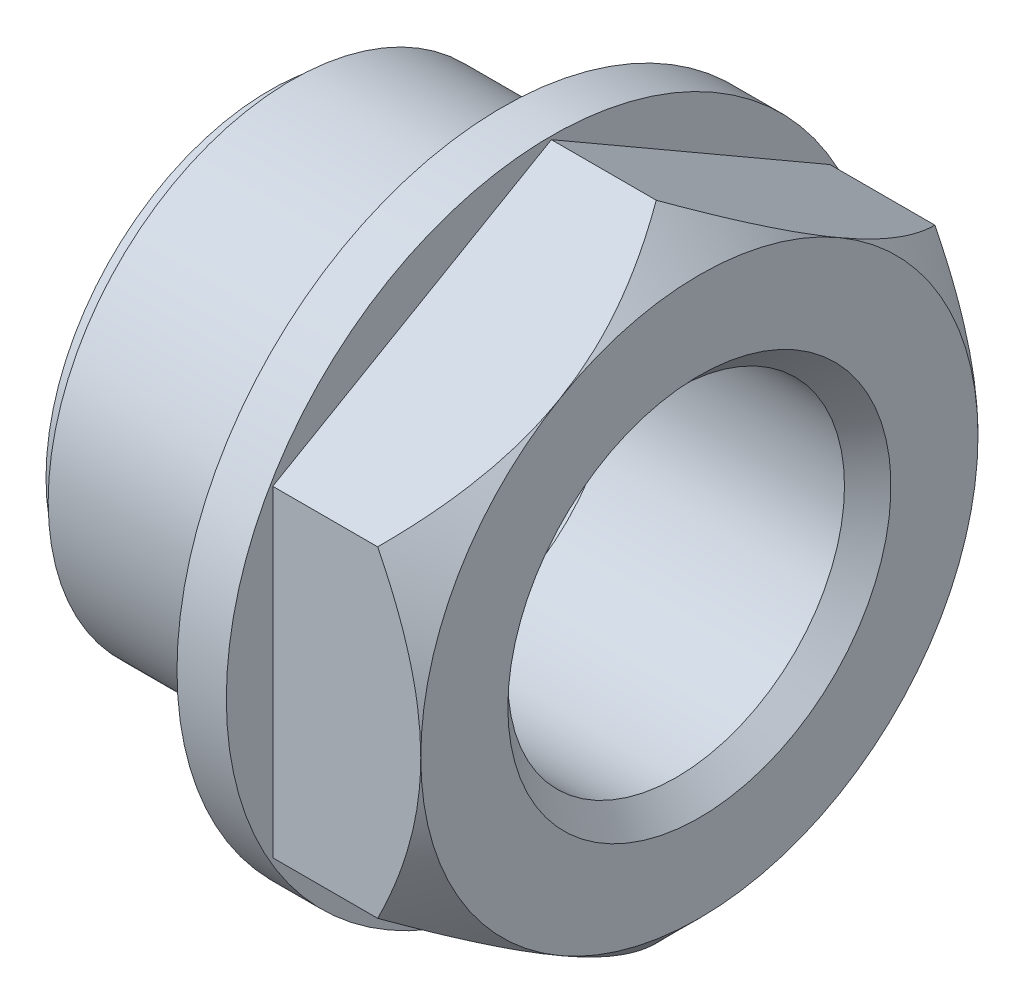
ISO-10303-21;
HEADER;
FILE_DESCRIPTION(('STEP AP214'),'2;1');
FILE_NAME('part.step','',(''),(''),'','','');
FILE_SCHEMA(('AUTOMOTIVE_DESIGN { 1 0 10303 214 1 1 1 1 }'));
ENDSEC;
DATA;
#1=APPLICATION_CONTEXT('core data for automotive mechanical design processes');
#2=APPLICATION_PROTOCOL_DEFINITION('international standard','automotive_design',2000,#1);
#3=PRODUCT_CONTEXT('',#1,'mechanical');
#4=PRODUCT('Part','Part','',(#3));
#5=PRODUCT_RELATED_PRODUCT_CATEGORY('part','',(#4));
#6=PRODUCT_DEFINITION_FORMATION('','',#4);
#7=PRODUCT_DEFINITION_CONTEXT('part definition',#1,'design');
#8=PRODUCT_DEFINITION('design','',#6,#7);
#9=PRODUCT_DEFINITION_SHAPE('','',#8);
#10=(LENGTH_UNIT() NAMED_UNIT(*) SI_UNIT(.MILLI.,.METRE.));
#11=(NAMED_UNIT(*) PLANE_ANGLE_UNIT() SI_UNIT($,.RADIAN.));
#12=(NAMED_UNIT(*) SI_UNIT($,.STERADIAN.) SOLID_ANGLE_UNIT());
#13=UNCERTAINTY_MEASURE_WITH_UNIT(LENGTH_MEASURE(1.E-05),#10,'distance_accuracy_value','');
#14=(GEOMETRIC_REPRESENTATION_CONTEXT(3) GLOBAL_UNCERTAINTY_ASSIGNED_CONTEXT((#13)) GLOBAL_UNIT_ASSIGNED_CONTEXT((#10,
#11,#12)) REPRESENTATION_CONTEXT('',''));
#15=CARTESIAN_POINT('',(0.,0.,0.));
#16=DIRECTION('',(0.,0.,1.));
#17=DIRECTION('',(1.,0.,0.));
#18=AXIS2_PLACEMENT_3D('',#15,#16,#17);
#19=CARTESIAN_POINT('',(18.5,0.,0.));
#20=DIRECTION('',(-1.,0.,0.));
#21=DIRECTION('',(0.,0.,1.));
#22=AXIS2_PLACEMENT_3D('',#19,#20,#21);
#23=CONICAL_SURFACE('',#22,12.,0.785398163397449);
#24=CARTESIAN_POINT('',(16.6434780679518,-6.92808776022166,-12.0002));
#25=CARTESIAN_POINT('',(16.7626309564783,-7.04725827421276,-11.7937906150033));
#26=CARTESIAN_POINT('',(16.8781461645336,-7.16736256447531,-11.5857638820616));
#27=CARTESIAN_POINT('',(17.1007451125441,-7.40958418453946,-11.1662237294189));
#28=CARTESIAN_POINT('',(17.2078242362867,-7.53170257285939,-10.9547084763103));
#29=CARTESIAN_POINT('',(17.4128476016986,-7.77867303027696,-10.5269430960946));
#30=CARTESIAN_POINT('',(17.5107360726841,-7.9035367425358,-10.3106728024406));
#31=CARTESIAN_POINT('',(17.6952506861876,-8.15531589028206,-9.87457852625775));
#32=CARTESIAN_POINT('',(17.7818785585455,-8.2822310072591,-9.65475509540497));
#33=CARTESIAN_POINT('',(17.9410500559202,-8.53594594203989,-9.21530793772564));
#34=CARTESIAN_POINT('',(18.0138038761164,-8.66271260305016,-8.99574164015001));
#35=CARTESIAN_POINT('',(18.1455183810797,-8.91802167176284,-8.55353336150658));
#36=CARTESIAN_POINT('',(18.2044805504032,-9.04656388676268,-8.33089171420943));
#37=CARTESIAN_POINT('',(18.3071286295363,-9.30487475223742,-7.88348417106011));
#38=CARTESIAN_POINT('',(18.3508488796767,-9.43463996031193,-7.65872423762031));
#39=CARTESIAN_POINT('',(18.4220532673444,-9.69525900315613,-7.20731881399421));
#40=CARTESIAN_POINT('',(18.4495398259497,-9.82611267264023,-6.98067361009094));
#41=CARTESIAN_POINT('',(18.4956412750118,-10.1450404841456,-6.42827443661697));
#42=CARTESIAN_POINT('',(18.5053208855655,-10.3334594789299,-6.10192316453954));
#43=CARTESIAN_POINT('',(18.4890980465457,-10.7099563657384,-5.44981142769568));
#44=CARTESIAN_POINT('',(18.4631832514429,-10.8980341167473,-5.12405120717506));
#45=CARTESIAN_POINT('',(18.3772787252829,-11.2725119091631,-4.47543664440456));
#46=CARTESIAN_POINT('',(18.3172339284154,-11.4589087436354,-4.15258785672866));
#47=CARTESIAN_POINT('',(18.1663231646221,-11.8284980224484,-3.51244044789178));
#48=CARTESIAN_POINT('',(18.0754592157103,-12.0116906757708,-3.19514146476407));
#49=CARTESIAN_POINT('',(17.8812081682261,-12.3496037137991,-2.60985891435905));
#50=CARTESIAN_POINT('',(17.7811900303363,-12.5048164669471,-2.34102253992421));
#51=CARTESIAN_POINT('',(17.5639618501166,-12.8122106815639,-1.80860014225517));
#52=CARTESIAN_POINT('',(17.4467494722819,-12.9643917280396,-1.54501483781027));
#53=CARTESIAN_POINT('',(17.1981500202119,-13.2652001216409,-1.02399941674966));
#54=CARTESIAN_POINT('',(17.066812297468,-13.413837758882,-0.766551477131132));
#55=CARTESIAN_POINT('',(16.7919315078429,-13.7081173639342,-0.256844249549294));
#56=CARTESIAN_POINT('',(16.6483989869357,-13.8537617875594,-0.0045807079914952));
#57=CARTESIAN_POINT('',(16.4998,-13.9980502621059,0.245334260869707));
#58=B_SPLINE_CURVE_WITH_KNOTS('',3,(#24,#25,#26,#27,#28,#29,#30,#31,#32,#33,#34,#35,#36,#37,#38,
#39,#40,#41,#42,#43,#44,#45,#46,#47,#48,#49,#50,#51,#52,#53,#54,#55,#56,#57),.UNSPECIFIED.,.F.,
.F.,(4,2,2,2,2,2,2,2,2,2,2,2,2,2,2,2,4),(0.,0.799430394157372,1.5992952401825,2.40373652533596,
3.20805408674572,3.99900075174728,4.78986223870271,5.57893020644191,6.36788046355996,
7.49700539321976,8.62652204639412,9.75786627104043,10.8891364304499,11.8670041205559,
12.8450047582599,13.8196930932652,14.7935469410798),.UNSPECIFIED.);
#59=CARTESIAN_POINT('',(18.4999999999999,-10.3923048454133,-6.00000000000029));
#60=VERTEX_POINT('',#59);
#61=CARTESIAN_POINT('',(16.6435935394487,-13.8564064605513,0.));
#62=VERTEX_POINT('',#61);
#63=EDGE_CURVE('E170',#60,#62,#58,.T.);
#64=ORIENTED_EDGE('',*,*,#63,.F.);
#65=CARTESIAN_POINT('',(18.5,0.,0.));
#66=DIRECTION('',(-1.,0.,0.));
#67=DIRECTION('',(0.,0.,1.));
#68=AXIS2_PLACEMENT_3D('',#65,#66,#67);
#69=CIRCLE('',#68,12.);
#70=CARTESIAN_POINT('',(18.4999999999999,-10.3923048454133,6.00000000000029));
#71=VERTEX_POINT('',#70);
#72=EDGE_CURVE('E64',#60,#71,#69,.T.);
#73=ORIENTED_EDGE('',*,*,#72,.T.);
#74=CARTESIAN_POINT('',(16.4998,-13.9980502621059,-0.245334260869708));
#75=CARTESIAN_POINT('',(16.6269729054387,-13.8745804582394,-0.0314782873722903));
#76=CARTESIAN_POINT('',(16.7504136116514,-13.750122768499,0.184088754650642));
#77=CARTESIAN_POINT('',(16.9885783370757,-13.4990549708068,0.618950936397981));
#78=CARTESIAN_POINT('',(17.1032972471361,-13.3724436536124,0.838248170591873));
#79=CARTESIAN_POINT('',(17.3233236195387,-13.1162102178244,1.28205749997464));
#80=CARTESIAN_POINT('',(17.4285654893867,-12.9865739322456,1.50659413310153));
#81=CARTESIAN_POINT('',(17.6272149205498,-12.7250665616992,1.95953818544167));
#82=CARTESIAN_POINT('',(17.7206244075275,-12.5931958443452,2.1879449679294));
#83=CARTESIAN_POINT('',(17.8925363648833,-12.3293971506111,2.64485770844709));
#84=CARTESIAN_POINT('',(17.9712559615158,-12.1975047635675,2.87330202393815));
#85=CARTESIAN_POINT('',(18.1139595472035,-11.931745649817,3.33361031152835));
#86=CARTESIAN_POINT('',(18.1779453396937,-11.7978791668785,3.56547386140852));
#87=CARTESIAN_POINT('',(18.2894605357242,-11.5287855572669,4.03155766524782));
#88=CARTESIAN_POINT('',(18.3370317016951,-11.3935627979265,4.26577035476503));
#89=CARTESIAN_POINT('',(18.4146030602124,-11.1218860468242,4.73632829090946));
#90=CARTESIAN_POINT('',(18.4446063669944,-10.9854322776395,4.97267315202159));
#91=CARTESIAN_POINT('',(18.493895890064,-10.6602879747692,5.53583960438449));
#92=CARTESIAN_POINT('',(18.5048997110261,-10.4712643997704,5.86323804011073));
#93=CARTESIAN_POINT('',(18.4910727600054,-10.0934943711001,6.51755492334436));
#94=CARTESIAN_POINT('',(18.4662284815275,-9.904748048714,6.84447314345889));
#95=CARTESIAN_POINT('',(18.3821945096073,-9.52905889720734,7.49518584172083));
#96=CARTESIAN_POINT('',(18.3229780552043,-9.34211758882861,7.81897768586618));
#97=CARTESIAN_POINT('',(18.1734587817858,-8.97142918954832,8.46102882719599));
#98=CARTESIAN_POINT('',(18.08315854133,-8.78768183501967,8.77928858099597));
#99=CARTESIAN_POINT('',(17.8965814095832,-8.46074704145265,9.34555625421607));
#100=CARTESIAN_POINT('',(17.8051794701499,-8.31685070698465,9.59479201653755));
#101=CARTESIAN_POINT('',(17.6074021227492,-8.03165763402666,10.0887609088675));
#102=CARTESIAN_POINT('',(17.5010261156359,-7.89036099981241,10.333493858265));
#103=CARTESIAN_POINT('',(17.275673580929,-7.61074893243883,10.8177961653654));
#104=CARTESIAN_POINT('',(17.1567303126305,-7.47242674113807,11.0573772285126));
#105=CARTESIAN_POINT('',(16.9078857275116,-7.19836848133702,11.5320600587219));
#106=CARTESIAN_POINT('',(16.7779914148457,-7.062630826894,11.7671645727174));
#107=CARTESIAN_POINT('',(16.6434780679518,-6.92808776022166,12.0002));
#108=B_SPLINE_CURVE_WITH_KNOTS('',3,(#74,#75,#76,#77,#78,#79,#80,#81,#82,#83,#84,#85,#86,#87,
#88,#89,#90,#91,#92,#93,#94,#95,#96,#97,#98,#99,#100,#101,#102,#103,#104,#105,#106,#107),
.UNSPECIFIED.,.F.,.F.,(4,2,2,2,2,2,2,2,2,2,2,2,2,2,2,2,4),(0.,0.833327182447637,
1.66713881836079,2.50633742380678,3.34539927782316,4.17085794897006,4.99621552923282,
5.81945746079788,6.64255341293161,7.77540596130831,8.90868544621678,10.0428484482012,
11.1769173882041,12.0823573313419,12.9878335134584,13.8909706838476,14.7935345383345),.UNSPECIFIED.);
#109=EDGE_CURVE('E202',#62,#71,#108,.T.);
#110=ORIENTED_EDGE('',*,*,#109,.F.);
#111=EDGE_LOOP('',(#64,#73,#110));
#112=FACE_BOUND('',#111,.T.);
#113=ADVANCED_FACE('F37',(#112),#23,.T.);
#114=CARTESIAN_POINT('',(16.643593539449,-6.9282032302755,-12.));
#115=VERTEX_POINT('',#114);
#116=EDGE_CURVE('E176',#115,#60,#58,.T.);
#117=ORIENTED_EDGE('',*,*,#116,.F.);
#118=CARTESIAN_POINT('',(6.37536400753361,20.9284032302755,-12.));
#119=CARTESIAN_POINT('',(6.64380440014325,20.6189534208901,-12.));
#120=CARTESIAN_POINT('',(6.91141760638712,20.3087833819575,-12.));
#121=CARTESIAN_POINT('',(7.44474723060895,19.6868083591375,-12.));
#122=CARTESIAN_POINT('',(7.71046361720173,19.375003348345,-12.));
#123=CARTESIAN_POINT('',(8.23987310449811,18.7494266338179,-12.));
#124=CARTESIAN_POINT('',(8.50356519199413,18.4356540719907,-12.));
#125=CARTESIAN_POINT('',(9.02849309589425,17.8060616253635,-12.));
#126=CARTESIAN_POINT('',(9.28972892090292,17.4902417477421,-12.));
#127=CARTESIAN_POINT('',(9.8153485763839,16.8490149294833,-12.));
#128=CARTESIAN_POINT('',(10.0796670115465,16.5235543357839,-12.));
#129=CARTESIAN_POINT('',(10.6048874137444,15.8698887027009,-12.));
#130=CARTESIAN_POINT('',(10.8657894025875,15.5416836808577,-12.));
#131=CARTESIAN_POINT('',(11.3835504222746,14.8822158720782,-12.));
#132=CARTESIAN_POINT('',(11.6404103522427,14.5509537919324,-12.));
#133=CARTESIAN_POINT('',(12.1494420275296,13.8848526133624,-12.));
#134=CARTESIAN_POINT('',(12.4016138709208,13.5500135899974,-12.));
#135=CARTESIAN_POINT('',(12.9007462452895,12.875759689226,-12.));
#136=CARTESIAN_POINT('',(13.1476992099492,12.5363392001999,-12.));
#137=CARTESIAN_POINT('',(13.6349501729233,11.8527379298735,-12.));
#138=CARTESIAN_POINT('',(13.8752480966357,11.5085570952751,-12.));
#139=CARTESIAN_POINT('',(14.3480118691476,10.8144061343471,-12.));
#140=CARTESIAN_POINT('',(14.580470766817,10.4644312599532,-12.));
#141=CARTESIAN_POINT('',(15.0355749344836,9.75814492172629,-12.));
#142=CARTESIAN_POINT('',(15.2582204177791,9.40183359585485,-12.));
#143=CARTESIAN_POINT('',(15.689801306166,8.68466420944832,-12.));
#144=CARTESIAN_POINT('',(15.8988282859291,8.32386151464899,-12.));
#145=CARTESIAN_POINT('',(16.302218528842,7.59404364200581,-12.));
#146=CARTESIAN_POINT('',(16.4965800253188,7.2250274816411,-12.));
#147=CARTESIAN_POINT('',(16.8667665495794,6.47842510422734,-12.));
#148=CARTESIAN_POINT('',(17.0426186980572,6.10085243966692,-12.));
#149=CARTESIAN_POINT('',(17.3716324589233,5.3360195808439,-12.));
#150=CARTESIAN_POINT('',(17.5248028839769,4.94876321776656,-12.));
#151=CARTESIAN_POINT('',(17.8064925685956,4.15521737324585,-12.));
#152=CARTESIAN_POINT('',(17.9343634583234,3.7486949746739,-12.));
#153=CARTESIAN_POINT('',(18.154763927401,2.92600161456735,-12.));
#154=CARTESIAN_POINT('',(18.247299146569,2.50983220401922,-12.));
#155=CARTESIAN_POINT('',(18.3551144888565,1.88165253929216,-12.));
#156=CARTESIAN_POINT('',(18.3858431552323,1.67222487231892,-12.));
#157=CARTESIAN_POINT('',(18.4366543494607,1.25209161640121,-12.));
#158=CARTESIAN_POINT('',(18.4567384010099,1.04138621472456,-12.));
#159=CARTESIAN_POINT('',(18.4858802627761,0.619215110658981,-12.));
#160=CARTESIAN_POINT('',(18.4949381463974,0.407749413340962,-12.));
#161=CARTESIAN_POINT('',(18.5018544875391,-0.0153671275037674,-12.));
#162=CARTESIAN_POINT('',(18.4997129357514,-0.227017971184209,-12.));
#163=CARTESIAN_POINT('',(18.48426166158,-0.650179965550344,-12.));
#164=CARTESIAN_POINT('',(18.4709376832987,-0.861690592846962,-12.));
#165=CARTESIAN_POINT('',(18.4333579581847,-1.28376239796175,-12.));
#166=CARTESIAN_POINT('',(18.409100672402,-1.49432343790234,-12.));
#167=CARTESIAN_POINT('',(18.3500981768952,-1.91396651957052,-12.));
#168=CARTESIAN_POINT('',(18.315352949533,-2.12304855881018,-12.));
#169=CARTESIAN_POINT('',(18.2359693656868,-2.53933715500555,-12.));
#170=CARTESIAN_POINT('',(18.1913295568058,-2.74654343197116,-12.));
#171=CARTESIAN_POINT('',(18.042909975463,-3.36769367455211,-12.));
#172=CARTESIAN_POINT('',(17.9250456722341,-3.77832357510359,-12.));
#173=CARTESIAN_POINT('',(17.6581568390363,-4.58908908659384,-12.));
#174=CARTESIAN_POINT('',(17.5091319347954,-4.98922457141853,-12.));
#175=CARTESIAN_POINT('',(17.149606841399,-5.86750639833168,-12.));
#176=CARTESIAN_POINT('',(16.932813170233,-6.34305941216894,-12.));
#177=CARTESIAN_POINT('',(16.4703064429547,-7.2800021833807,-12.));
#178=CARTESIAN_POINT('',(16.2245766907228,-7.74138356824329,-12.));
#179=CARTESIAN_POINT('',(15.7106214931412,-8.65260023583258,-12.));
#180=CARTESIAN_POINT('',(15.4423505409304,-9.10240964509926,-12.));
#181=CARTESIAN_POINT('',(14.8889262981418,-9.99132179665033,-12.));
#182=CARTESIAN_POINT('',(14.603776370631,-10.4304266473226,-12.));
#183=CARTESIAN_POINT('',(14.0187425467505,-11.3020670801597,-12.));
#184=CARTESIAN_POINT('',(13.7187881942847,-11.7345551497397,-12.));
#185=CARTESIAN_POINT('',(13.1083657048575,-12.5920436802039,-12.));
#186=CARTESIAN_POINT('',(12.7978971648244,-13.0170438530805,-12.));
#187=CARTESIAN_POINT('',(12.1689185619681,-13.8602768689114,-12.));
#188=CARTESIAN_POINT('',(11.8504181131032,-14.2785169028641,-12.));
#189=CARTESIAN_POINT('',(11.2066256827086,-15.1097107659909,-12.));
#190=CARTESIAN_POINT('',(10.8813338494492,-15.5226647102548,-12.));
#191=CARTESIAN_POINT('',(10.2127174831834,-16.3596944659025,-12.));
#192=CARTESIAN_POINT('',(9.86917710450726,-16.7835975869737,-12.));
#193=CARTESIAN_POINT('',(9.17707230555703,-17.627406300521,-12.));
#194=CARTESIAN_POINT('',(8.82850697800671,-18.0473111477777,-12.));
#195=CARTESIAN_POINT('',(8.13105843639343,-18.8791005734297,-12.));
#196=CARTESIAN_POINT('',(7.78221994674691,-19.2910227057156,-12.));
#197=CARTESIAN_POINT('',(7.08118049393271,-20.111842914661,-12.));
#198=CARTESIAN_POINT('',(6.72898027493915,-20.5207416265975,-12.));
#199=CARTESIAN_POINT('',(6.37536400753361,-20.9284032302755,-12.));
#200=B_SPLINE_CURVE_WITH_KNOTS('',3,(#118,#119,#120,#121,#122,#123,#124,#125,#126,#127,#128,
#129,#130,#131,#132,#133,#134,#135,#136,#137,#138,#139,#140,#141,#142,#143,#144,#145,#146,#147,
#148,#149,#150,#151,#152,#153,#154,#155,#156,#157,#158,#159,#160,#161,#162,#163,#164,#165,#166,
#167,#168,#169,#170,#171,#172,#173,#174,#175,#176,#177,#178,#179,#180,#181,#182,#183,#184,#185,
#186,#187,#188,#189,#190,#191,#192,#193,#194,#195,#196,#197,#198,#199),.UNSPECIFIED.,.F.,.F.,(4,
2,2,2,2,2,2,2,2,2,2,2,2,2,2,2,2,2,2,2,2,2,2,2,2,2,2,2,2,2,2,2,2,2,2,2,2,2,2,2,4),(0.,
1.22897461086997,2.4579695096874,3.68754396406036,4.91711410949197,6.17490962877612,
7.43269711534705,8.69020074523212,9.94767803908658,11.2068681706004,12.4660724117344,
13.7263653436709,14.9866308691529,16.2372893046178,17.48809816054,18.7370479878683,
19.9855112728132,21.2627036234341,22.5396920400056,23.1744741499048,23.8091653709634,
24.4438523666815,25.0785398898982,25.7140377746723,26.3496251387845,26.9852135717992,
27.6208953628545,28.900852877701,30.1808257670843,31.7473932295053,33.3148690718546,
34.8855891297086,36.4559972746053,38.0347790305325,39.6136213792645,41.19065606485,
42.7676563563272,44.4045059820674,46.0416549445752,47.6609907735048,49.2799760863945),.UNSPECIFIED.);
#201=CARTESIAN_POINT('',(18.5,0.,-12.));
#202=VERTEX_POINT('',#201);
#203=EDGE_CURVE('E177',#202,#115,#200,.T.);
#204=ORIENTED_EDGE('',*,*,#203,.F.);
#205=EDGE_CURVE('E290',#202,#60,#69,.T.);
#206=ORIENTED_EDGE('',*,*,#205,.T.);
#207=EDGE_LOOP('',(#117,#204,#206));
#208=FACE_BOUND('',#207,.T.);
#209=ADVANCED_FACE('F250',(#208),#23,.T.);
#210=CARTESIAN_POINT('',(16.4997939643004,13.9980561208773,0.245344408559351));
#211=CARTESIAN_POINT('',(16.6269672138527,13.8745861301617,0.0314881114299225));
#212=CARTESIAN_POINT('',(16.750408259919,13.7501282512233,-0.184079258293534));
#213=CARTESIAN_POINT('',(16.9885736522766,13.4990600690598,-0.618942105964711));
#214=CARTESIAN_POINT('',(17.1032928893941,13.3724485565852,-0.838239678393825));
#215=CARTESIAN_POINT('',(17.3233199036231,13.1162147180146,-1.28204970541653));
#216=CARTESIAN_POINT('',(17.4285620877961,12.9865782248183,-1.50658669814758));
#217=CARTESIAN_POINT('',(17.6272121220619,12.7250704310444,-1.9595314835391));
#218=CARTESIAN_POINT('',(17.7206218978266,12.5931994980828,-2.1879386394701));
#219=CARTESIAN_POINT('',(17.892534392438,12.3294003714479,-2.64485212979411));
#220=CARTESIAN_POINT('',(17.9712542384356,12.1975077673112,-2.87329682130146));
#221=CARTESIAN_POINT('',(18.1139582821315,11.9317482108796,-3.33360587563797));
#222=CARTESIAN_POINT('',(18.1779442832793,11.7978815023552,-3.5654698162441));
#223=CARTESIAN_POINT('',(18.2894598454658,11.5287874359383,-4.03155441129353));
#224=CARTESIAN_POINT('',(18.3370311692724,11.3935644454205,-4.26576750122166));
#225=CARTESIAN_POINT('',(18.414602785584,11.1218872259435,-4.73632624861486));
#226=CARTESIAN_POINT('',(18.4446061923563,10.9854332195642,-4.97267152056027));
#227=CARTESIAN_POINT('',(18.4938958311935,10.6602886515084,-5.53583843223781));
#228=CARTESIAN_POINT('',(18.5048996957399,10.4712650492066,-5.86323691525428));
#229=CARTESIAN_POINT('',(18.4910728207992,10.0934949638343,-6.51755389669859));
#230=CARTESIAN_POINT('',(18.4662285747677,9.90474861204901,-6.84447216773402));
#231=CARTESIAN_POINT('',(18.3821946556836,9.52905940358348,-7.49518496465163));
#232=CARTESIAN_POINT('',(18.3229782221417,9.34211806761711,-7.81897685658018));
#233=CARTESIAN_POINT('',(18.1734589789151,8.97142961329994,-8.46102809323664));
#234=CARTESIAN_POINT('',(18.0831587478004,8.78768223132109,-8.77928789458177));
#235=CARTESIAN_POINT('',(17.8965816180512,8.46074737916382,-9.34555566928315));
#236=CARTESIAN_POINT('',(17.8051796719484,8.31685101358809,-9.59479148548481));
#237=CARTESIAN_POINT('',(17.6074023037363,8.03165787939985,-10.0887604838686));
#238=CARTESIAN_POINT('',(17.5010262824773,7.89036121506371,-10.3334934854388));
#239=CARTESIAN_POINT('',(17.2756737112926,7.61074908596276,-10.8177958994541));
#240=CARTESIAN_POINT('',(17.1567304204338,7.4724268631032,-11.0573770172628));
#241=CARTESIAN_POINT('',(16.9078857850025,7.19836854142939,-11.5320599546388));
#242=CARTESIAN_POINT('',(16.7779914445948,7.06263085667006,-11.7671645211437));
#243=CARTESIAN_POINT('',(16.6434780679518,6.92808776022166,-12.0002));
#244=B_SPLINE_CURVE_WITH_KNOTS('',3,(#210,#211,#212,#213,#214,#215,#216,#217,#218,#219,#220,
#221,#222,#223,#224,#225,#226,#227,#228,#229,#230,#231,#232,#233,#234,#235,#236,#237,#238,#239,
#240,#241,#242,#243),.UNSPECIFIED.,.F.,.F.,(4,2,2,2,2,2,2,2,2,2,2,2,2,2,2,2,4),(0.,
0.833328652019327,1.6671417597733,2.50634187346393,3.34540523512295,4.17086536696721,
4.99622440721132,5.81946778438311,6.6425651808592,7.77541789640256,8.9086975499695,
10.0428607048542,11.1769297973982,12.082369924131,12.9878462900607,13.8909836609492,
14.7935477152185),.UNSPECIFIED.);
#245=CARTESIAN_POINT('',(16.6435935394487,13.8564064605513,0.));
#246=VERTEX_POINT('',#245);
#247=CARTESIAN_POINT('',(18.4999999999999,10.3923048454133,-6.00000000000029));
#248=VERTEX_POINT('',#247);
#249=EDGE_CURVE('E147',#246,#248,#244,.T.);
#250=ORIENTED_EDGE('',*,*,#249,.F.);
#251=CARTESIAN_POINT('',(16.6434780679518,6.92808776022166,12.0002));
#252=CARTESIAN_POINT('',(16.7626309564783,7.04725827421276,11.7937906150033));
#253=CARTESIAN_POINT('',(16.8781461645336,7.16736256447531,11.5857638820616));
#254=CARTESIAN_POINT('',(17.1007451125441,7.40958418453946,11.1662237294189));
#255=CARTESIAN_POINT('',(17.2078242362867,7.53170257285939,10.9547084763103));
#256=CARTESIAN_POINT('',(17.4128476016986,7.77867303027696,10.5269430960946));
#257=CARTESIAN_POINT('',(17.5107360726841,7.9035367425358,10.3106728024406));
#258=CARTESIAN_POINT('',(17.6952506861876,8.15531589028206,9.87457852625775));
#259=CARTESIAN_POINT('',(17.7818785585455,8.2822310072591,9.65475509540497));
#260=CARTESIAN_POINT('',(17.9410500559202,8.53594594203989,9.21530793772564));
#261=CARTESIAN_POINT('',(18.0138038761164,8.66271260305016,8.99574164015001));
#262=CARTESIAN_POINT('',(18.1455183810797,8.91802167176284,8.55353336150658));
#263=CARTESIAN_POINT('',(18.2044805504032,9.04656388676268,8.33089171420943));
#264=CARTESIAN_POINT('',(18.3071286295363,9.30487475223742,7.88348417106011));
#265=CARTESIAN_POINT('',(18.3508488796767,9.43463996031193,7.65872423762031));
#266=CARTESIAN_POINT('',(18.4220532673444,9.69525900315613,7.20731881399421));
#267=CARTESIAN_POINT('',(18.4495398259497,9.82611267264023,6.98067361009094));
#268=CARTESIAN_POINT('',(18.4956412750118,10.1450404841456,6.42827443661697));
#269=CARTESIAN_POINT('',(18.5053208855655,10.3334594789299,6.10192316453954));
#270=CARTESIAN_POINT('',(18.4890980465457,10.7099563657384,5.44981142769568));
#271=CARTESIAN_POINT('',(18.4631832514429,10.8980341167473,5.12405120717506));
#272=CARTESIAN_POINT('',(18.3772787252829,11.2725119091631,4.47543664440456));
#273=CARTESIAN_POINT('',(18.3172339284154,11.4589087436354,4.15258785672866));
#274=CARTESIAN_POINT('',(18.1663231646221,11.8284980224484,3.51244044789178));
#275=CARTESIAN_POINT('',(18.0754592157103,12.0116906757708,3.19514146476407));
#276=CARTESIAN_POINT('',(17.8812081682261,12.3496037137991,2.60985891435905));
#277=CARTESIAN_POINT('',(17.7811900303363,12.5048164669471,2.34102253992421));
#278=CARTESIAN_POINT('',(17.5639618501166,12.8122106815639,1.80860014225517));
#279=CARTESIAN_POINT('',(17.4467494722819,12.9643917280396,1.54501483781027));
#280=CARTESIAN_POINT('',(17.1981500202119,13.2652001216409,1.02399941674966));
#281=CARTESIAN_POINT('',(17.066812297468,13.413837758882,0.766551477131132));
#282=CARTESIAN_POINT('',(16.7919315078429,13.7081173639342,0.256844249549294));
#283=CARTESIAN_POINT('',(16.6483989869357,13.8537617875594,0.0045807079914952));
#284=CARTESIAN_POINT('',(16.4998,13.9980502621059,-0.245334260869707));
#285=B_SPLINE_CURVE_WITH_KNOTS('',3,(#251,#252,#253,#254,#255,#256,#257,#258,#259,#260,#261,
#262,#263,#264,#265,#266,#267,#268,#269,#270,#271,#272,#273,#274,#275,#276,#277,#278,#279,#280,
#281,#282,#283,#284),.UNSPECIFIED.,.F.,.F.,(4,2,2,2,2,2,2,2,2,2,2,2,2,2,2,2,4),(0.,
0.799430394157372,1.5992952401825,2.40373652533596,3.20805408674572,3.99900075174728,
4.78986223870271,5.57893020644191,6.36788046355996,7.49700539321976,8.62652204639412,
9.75786627104043,10.8891364304499,11.8670041205559,12.8450047582599,13.8196930932652,
14.7935469410798),.UNSPECIFIED.);
#286=CARTESIAN_POINT('',(18.4999999999999,10.3923048454133,6.00000000000029));
#287=VERTEX_POINT('',#286);
#288=EDGE_CURVE('E194',#287,#246,#285,.T.);
#289=ORIENTED_EDGE('',*,*,#288,.F.);
#290=EDGE_CURVE('E279',#287,#248,#69,.T.);
#291=ORIENTED_EDGE('',*,*,#290,.T.);
#292=EDGE_LOOP('',(#250,#289,#291));
#293=FACE_BOUND('',#292,.T.);
#294=ADVANCED_FACE('F245',(#293),#23,.T.);
#295=CARTESIAN_POINT('',(16.643593539449,6.9282032302755,-12.));
#296=VERTEX_POINT('',#295);
#297=EDGE_CURVE('E120',#248,#296,#244,.T.);
#298=ORIENTED_EDGE('',*,*,#297,.F.);
#299=EDGE_CURVE('E280',#248,#202,#69,.T.);
#300=ORIENTED_EDGE('',*,*,#299,.T.);
#301=EDGE_CURVE('E183',#296,#202,#200,.T.);
#302=ORIENTED_EDGE('',*,*,#301,.F.);
#303=EDGE_LOOP('',(#298,#300,#302));
#304=FACE_BOUND('',#303,.T.);
#305=ADVANCED_FACE('F240',(#304),#23,.T.);
#306=CARTESIAN_POINT('',(18.5,0.,0.));
#307=DIRECTION('',(-1.,0.,0.));
#308=DIRECTION('',(0.,0.,1.));
#309=AXIS2_PLACEMENT_3D('',#306,#307,#308);
#310=CYLINDRICAL_SURFACE('',#309,14.);
#311=CARTESIAN_POINT('',(10.,0.,0.));
#312=DIRECTION('',(-1.,0.,0.));
#313=DIRECTION('',(0.,0.,1.));
#314=AXIS2_PLACEMENT_3D('',#311,#312,#313);
#315=CIRCLE('',#314,14.);
#316=CARTESIAN_POINT('',(10.,0.,14.));
#317=VERTEX_POINT('',#316);
#318=EDGE_CURVE('E277',#317,#317,#315,.T.);
#319=ORIENTED_EDGE('',*,*,#318,.F.);
#320=EDGE_LOOP('',(#319));
#321=FACE_BOUND('',#320,.T.);
#322=CARTESIAN_POINT('',(12.125,0.,0.));
#323=DIRECTION('',(1.,0.,0.));
#324=DIRECTION('',(0.,0.,-1.));
#325=AXIS2_PLACEMENT_3D('',#322,#323,#324);
#326=CIRCLE('',#325,14.);
#327=CARTESIAN_POINT('',(12.125,0.,-14.));
#328=VERTEX_POINT('',#327);
#329=EDGE_CURVE('E271',#328,#328,#326,.T.);
#330=ORIENTED_EDGE('',*,*,#329,.F.);
#331=EDGE_LOOP('',(#330));
#332=FACE_BOUND('',#331,.T.);
#333=ADVANCED_FACE('F222',(#321,#332),#310,.T.);
#334=CARTESIAN_POINT('',(24.875,-14.433756729741,-1.));
#335=DIRECTION('',(0.,-0.866025403784428,0.500000000000018));
#336=DIRECTION('',(0.,-0.500000000000018,-0.866025403784428));
#337=AXIS2_PLACEMENT_3D('',#334,#335,#336);
#338=PLANE('',#337);
#339=DIRECTION('',(0.,0.500000000000018,0.866025403784428));
#340=VECTOR('',#339,1.);
#341=CARTESIAN_POINT('',(12.125,-14.433756729741,-1.));
#342=LINE('',#341,#340);
#343=CARTESIAN_POINT('',(12.125,-13.8564064605513,0.));
#344=VERTEX_POINT('',#343);
#345=CARTESIAN_POINT('',(12.125,-6.9282032302755,12.));
#346=VERTEX_POINT('',#345);
#347=EDGE_CURVE('E184',#344,#346,#342,.T.);
#348=ORIENTED_EDGE('',*,*,#347,.F.);
#349=DIRECTION('',(1.,0.,0.));
#350=VECTOR('',#349,1.);
#351=CARTESIAN_POINT('',(24.875,-13.8564064605513,0.));
#352=LINE('',#351,#350);
#353=EDGE_CURVE('E154',#344,#62,#352,.T.);
#354=ORIENTED_EDGE('',*,*,#353,.T.);
#355=ORIENTED_EDGE('',*,*,#109,.T.);
#356=CARTESIAN_POINT('',(16.643593539449,-6.9282032302755,12.));
#357=VERTEX_POINT('',#356);
#358=EDGE_CURVE('E275',#71,#357,#108,.T.);
#359=ORIENTED_EDGE('',*,*,#358,.T.);
#360=DIRECTION('',(-1.,0.,0.));
#361=VECTOR('',#360,1.);
#362=CARTESIAN_POINT('',(24.875,-6.9282032302755,12.));
#363=LINE('',#362,#361);
#364=EDGE_CURVE('E191',#357,#346,#363,.T.);
#365=ORIENTED_EDGE('',*,*,#364,.T.);
#366=EDGE_LOOP('',(#348,#354,#355,#359,#365));
#367=FACE_BOUND('',#366,.T.);
#368=ADVANCED_FACE('F213',(#367),#338,.T.);
#369=CARTESIAN_POINT('',(24.875,6.9282032302755,12.));
#370=DIRECTION('',(0.,0.866025403784428,0.500000000000018));
#371=DIRECTION('',(0.,-0.500000000000018,0.866025403784428));
#372=AXIS2_PLACEMENT_3D('',#369,#370,#371);
#373=PLANE('',#372);
#374=ORIENTED_EDGE('',*,*,#288,.T.);
#375=DIRECTION('',(-1.,0.,0.));
#376=VECTOR('',#375,1.);
#377=CARTESIAN_POINT('',(24.875,13.8564064605513,0.));
#378=LINE('',#377,#376);
#379=CARTESIAN_POINT('',(12.125,13.8564064605513,0.));
#380=VERTEX_POINT('',#379);
#381=EDGE_CURVE('E124',#246,#380,#378,.T.);
#382=ORIENTED_EDGE('',*,*,#381,.T.);
#383=DIRECTION('',(0.,0.500000000000018,-0.866025403784428));
#384=VECTOR('',#383,1.);
#385=CARTESIAN_POINT('',(12.125,6.9282032302755,12.));
#386=LINE('',#385,#384);
#387=CARTESIAN_POINT('',(12.125,6.9282032302755,12.));
#388=VERTEX_POINT('',#387);
#389=EDGE_CURVE('E136',#388,#380,#386,.T.);
#390=ORIENTED_EDGE('',*,*,#389,.F.);
#391=DIRECTION('',(-1.,0.,0.));
#392=VECTOR('',#391,1.);
#393=CARTESIAN_POINT('',(24.875,6.9282032302755,12.));
#394=LINE('',#393,#392);
#395=CARTESIAN_POINT('',(16.643593539449,6.9282032302755,12.));
#396=VERTEX_POINT('',#395);
#397=EDGE_CURVE('E189',#396,#388,#394,.T.);
#398=ORIENTED_EDGE('',*,*,#397,.F.);
#399=EDGE_CURVE('E201',#396,#287,#285,.T.);
#400=ORIENTED_EDGE('',*,*,#399,.T.);
#401=EDGE_LOOP('',(#374,#382,#390,#398,#400));
#402=FACE_BOUND('',#401,.T.);
#403=ADVANCED_FACE('F209',(#402),#373,.T.);
#404=ORIENTED_EDGE('',*,*,#358,.F.);
#405=CARTESIAN_POINT('',(18.5,0.,12.));
#406=VERTEX_POINT('',#405);
#407=EDGE_CURVE('E274',#71,#406,#69,.T.);
#408=ORIENTED_EDGE('',*,*,#407,.T.);
#409=CARTESIAN_POINT('',(6.37536400753361,-20.9284032302755,12.));
#410=CARTESIAN_POINT('',(6.64380440014325,-20.6189534208901,12.));
#411=CARTESIAN_POINT('',(6.91141760638712,-20.3087833819575,12.));
#412=CARTESIAN_POINT('',(7.44474723060895,-19.6868083591375,12.));
#413=CARTESIAN_POINT('',(7.71046361720173,-19.375003348345,12.));
#414=CARTESIAN_POINT('',(8.23987310449811,-18.7494266338179,12.));
#415=CARTESIAN_POINT('',(8.50356519199413,-18.4356540719907,12.));
#416=CARTESIAN_POINT('',(9.02849309589425,-17.8060616253635,12.));
#417=CARTESIAN_POINT('',(9.28972892090292,-17.4902417477421,12.));
#418=CARTESIAN_POINT('',(9.8153485763839,-16.8490149294833,12.));
#419=CARTESIAN_POINT('',(10.0796670115465,-16.5235543357839,12.));
#420=CARTESIAN_POINT('',(10.6048874137444,-15.8698887027009,12.));
#421=CARTESIAN_POINT('',(10.8657894025875,-15.5416836808577,12.));
#422=CARTESIAN_POINT('',(11.3835504222746,-14.8822158720782,12.));
#423=CARTESIAN_POINT('',(11.6404103522427,-14.5509537919324,12.));
#424=CARTESIAN_POINT('',(12.1494420275296,-13.8848526133624,12.));
#425=CARTESIAN_POINT('',(12.4016138709208,-13.5500135899974,12.));
#426=CARTESIAN_POINT('',(12.9007462452895,-12.875759689226,12.));
#427=CARTESIAN_POINT('',(13.1476992099492,-12.5363392001999,12.));
#428=CARTESIAN_POINT('',(13.6349501729233,-11.8527379298735,12.));
#429=CARTESIAN_POINT('',(13.8752480966357,-11.5085570952751,12.));
#430=CARTESIAN_POINT('',(14.3480118691476,-10.8144061343471,12.));
#431=CARTESIAN_POINT('',(14.580470766817,-10.4644312599532,12.));
#432=CARTESIAN_POINT('',(15.0355749344836,-9.75814492172629,12.));
#433=CARTESIAN_POINT('',(15.2582204177791,-9.40183359585485,12.));
#434=CARTESIAN_POINT('',(15.689801306166,-8.68466420944832,12.));
#435=CARTESIAN_POINT('',(15.8988282859291,-8.32386151464899,12.));
#436=CARTESIAN_POINT('',(16.302218528842,-7.59404364200581,12.));
#437=CARTESIAN_POINT('',(16.4965800253188,-7.2250274816411,12.));
#438=CARTESIAN_POINT('',(16.8667665495794,-6.47842510422734,12.));
#439=CARTESIAN_POINT('',(17.0426186980572,-6.10085243966692,12.));
#440=CARTESIAN_POINT('',(17.3716324589233,-5.3360195808439,12.));
#441=CARTESIAN_POINT('',(17.5248028839769,-4.94876321776656,12.));
#442=CARTESIAN_POINT('',(17.8064925685956,-4.15521737324585,12.));
#443=CARTESIAN_POINT('',(17.9343634583234,-3.7486949746739,12.));
#444=CARTESIAN_POINT('',(18.154763927401,-2.92600161456735,12.));
#445=CARTESIAN_POINT('',(18.247299146569,-2.50983220401922,12.));
#446=CARTESIAN_POINT('',(18.3551144888565,-1.88165253929216,12.));
#447=CARTESIAN_POINT('',(18.3858431552323,-1.67222487231892,12.));
#448=CARTESIAN_POINT('',(18.4366543494607,-1.25209161640121,12.));
#449=CARTESIAN_POINT('',(18.4567384010099,-1.04138621472456,12.));
#450=CARTESIAN_POINT('',(18.4858802627761,-0.619215110658981,12.));
#451=CARTESIAN_POINT('',(18.4949381463974,-0.407749413340962,12.));
#452=CARTESIAN_POINT('',(18.5018544875391,0.0153671275037674,12.));
#453=CARTESIAN_POINT('',(18.4997129357514,0.227017971184209,12.));
#454=CARTESIAN_POINT('',(18.48426166158,0.650179965550344,12.));
#455=CARTESIAN_POINT('',(18.4709376832987,0.861690592846962,12.));
#456=CARTESIAN_POINT('',(18.4333579581847,1.28376239796175,12.));
#457=CARTESIAN_POINT('',(18.409100672402,1.49432343790234,12.));
#458=CARTESIAN_POINT('',(18.3500981768952,1.91396651957052,12.));
#459=CARTESIAN_POINT('',(18.315352949533,2.12304855881018,12.));
#460=CARTESIAN_POINT('',(18.2359693656868,2.53933715500555,12.));
#461=CARTESIAN_POINT('',(18.1913295568058,2.74654343197116,12.));
#462=CARTESIAN_POINT('',(18.042909975463,3.36769367455211,12.));
#463=CARTESIAN_POINT('',(17.9250456722341,3.77832357510359,12.));
#464=CARTESIAN_POINT('',(17.6581568390363,4.58908908659384,12.));
#465=CARTESIAN_POINT('',(17.5091319347954,4.98922457141853,12.));
#466=CARTESIAN_POINT('',(17.149606841399,5.86750639833168,12.));
#467=CARTESIAN_POINT('',(16.932813170233,6.34305941216894,12.));
#468=CARTESIAN_POINT('',(16.4703064429547,7.2800021833807,12.));
#469=CARTESIAN_POINT('',(16.2245766907228,7.74138356824329,12.));
#470=CARTESIAN_POINT('',(15.7106214931412,8.65260023583258,12.));
#471=CARTESIAN_POINT('',(15.4423505409304,9.10240964509926,12.));
#472=CARTESIAN_POINT('',(14.8889262981418,9.99132179665033,12.));
#473=CARTESIAN_POINT('',(14.603776370631,10.4304266473226,12.));
#474=CARTESIAN_POINT('',(14.0187425467505,11.3020670801597,12.));
#475=CARTESIAN_POINT('',(13.7187881942847,11.7345551497397,12.));
#476=CARTESIAN_POINT('',(13.1083657048575,12.5920436802039,12.));
#477=CARTESIAN_POINT('',(12.7978971648244,13.0170438530805,12.));
#478=CARTESIAN_POINT('',(12.1689185619681,13.8602768689114,12.));
#479=CARTESIAN_POINT('',(11.8504181131032,14.2785169028641,12.));
#480=CARTESIAN_POINT('',(11.2066256827086,15.1097107659909,12.));
#481=CARTESIAN_POINT('',(10.8813338494492,15.5226647102548,12.));
#482=CARTESIAN_POINT('',(10.2127174831834,16.3596944659025,12.));
#483=CARTESIAN_POINT('',(9.86917710450726,16.7835975869737,12.));
#484=CARTESIAN_POINT('',(9.17707230555703,17.627406300521,12.));
#485=CARTESIAN_POINT('',(8.82850697800671,18.0473111477777,12.));
#486=CARTESIAN_POINT('',(8.13105843639343,18.8791005734297,12.));
#487=CARTESIAN_POINT('',(7.78221994674691,19.2910227057156,12.));
#488=CARTESIAN_POINT('',(7.08118049393271,20.111842914661,12.));
#489=CARTESIAN_POINT('',(6.72898027493915,20.5207416265975,12.));
#490=CARTESIAN_POINT('',(6.37536400753361,20.9284032302755,12.));
#491=B_SPLINE_CURVE_WITH_KNOTS('',3,(#409,#410,#411,#412,#413,#414,#415,#416,#417,#418,#419,
#420,#421,#422,#423,#424,#425,#426,#427,#428,#429,#430,#431,#432,#433,#434,#435,#436,#437,#438,
#439,#440,#441,#442,#443,#444,#445,#446,#447,#448,#449,#450,#451,#452,#453,#454,#455,#456,#457,
#458,#459,#460,#461,#462,#463,#464,#465,#466,#467,#468,#469,#470,#471,#472,#473,#474,#475,#476,
#477,#478,#479,#480,#481,#482,#483,#484,#485,#486,#487,#488,#489,#490),.UNSPECIFIED.,.F.,.F.,(4,
2,2,2,2,2,2,2,2,2,2,2,2,2,2,2,2,2,2,2,2,2,2,2,2,2,2,2,2,2,2,2,2,2,2,2,2,2,2,2,4),(0.,
1.22897461086997,2.4579695096874,3.68754396406036,4.91711410949197,6.17490962877612,
7.43269711534705,8.69020074523212,9.94767803908658,11.2068681706004,12.4660724117344,
13.7263653436709,14.9866308691529,16.2372893046178,17.48809816054,18.7370479878683,
19.9855112728132,21.2627036234341,22.5396920400056,23.1744741499048,23.8091653709634,
24.4438523666815,25.0785398898982,25.7140377746723,26.3496251387845,26.9852135717992,
27.6208953628545,28.900852877701,30.1808257670843,31.7473932295053,33.3148690718546,
34.8855891297086,36.4559972746053,38.0347790305325,39.6136213792645,41.19065606485,
42.7676563563272,44.4045059820674,46.0416549445752,47.6609907735048,49.2799760863945),.UNSPECIFIED.);
#492=EDGE_CURVE('E11',#357,#406,#491,.T.);
#493=ORIENTED_EDGE('',*,*,#492,.F.);
#494=EDGE_LOOP('',(#404,#408,#493));
#495=FACE_BOUND('',#494,.T.);
#496=ADVANCED_FACE('F212',(#495),#23,.T.);
#497=EDGE_CURVE('E41',#406,#396,#491,.T.);
#498=ORIENTED_EDGE('',*,*,#497,.F.);
#499=EDGE_CURVE('E269',#406,#287,#69,.T.);
#500=ORIENTED_EDGE('',*,*,#499,.T.);
#501=ORIENTED_EDGE('',*,*,#399,.F.);
#502=EDGE_LOOP('',(#498,#500,#501));
#503=FACE_BOUND('',#502,.T.);
#504=ADVANCED_FACE('F251',(#503),#23,.T.);
#505=CARTESIAN_POINT('',(0.,9.6416,0.));
#506=DIRECTION('',(1.,0.,0.));
#507=DIRECTION('',(0.,0.,-1.));
#508=AXIS2_PLACEMENT_3D('',#505,#506,#507);
#509=PLANE('',#508);
#510=CARTESIAN_POINT('',(0.,0.,0.));
#511=DIRECTION('',(-1.,0.,0.));
#512=DIRECTION('',(0.,0.,1.));
#513=AXIS2_PLACEMENT_3D('',#510,#511,#512);
#514=CIRCLE('',#513,8.25);
#515=CARTESIAN_POINT('',(0.,0.,8.25));
#516=VERTEX_POINT('',#515);
#517=EDGE_CURVE('E460',#516,#516,#514,.T.);
#518=ORIENTED_EDGE('',*,*,#517,.F.);
#519=EDGE_LOOP('',(#518));
#520=FACE_BOUND('',#519,.T.);
#521=CARTESIAN_POINT('',(0.,0.,0.));
#522=DIRECTION('',(-1.,0.,0.));
#523=DIRECTION('',(0.,0.,1.));
#524=AXIS2_PLACEMENT_3D('',#521,#522,#523);
#525=CIRCLE('',#524,9.6416);
#526=CARTESIAN_POINT('',(0.,0.,9.6416));
#527=VERTEX_POINT('',#526);
#528=EDGE_CURVE('E300',#527,#527,#525,.T.);
#529=ORIENTED_EDGE('',*,*,#528,.T.);
#530=EDGE_LOOP('',(#529));
#531=FACE_BOUND('',#530,.T.);
#532=ADVANCED_FACE('F39',(#520,#531),#509,.F.);
#533=CARTESIAN_POINT('',(18.5,0.,0.));
#534=DIRECTION('',(-1.,0.,0.));
#535=DIRECTION('',(0.,0.,1.));
#536=AXIS2_PLACEMENT_3D('',#533,#534,#535);
#537=CYLINDRICAL_SURFACE('',#536,8.25);
#538=CARTESIAN_POINT('',(7.6923076923077,0.,0.));
#539=DIRECTION('',(-1.,0.,0.));
#540=DIRECTION('',(0.,0.,1.));
#541=AXIS2_PLACEMENT_3D('',#538,#539,#540);
#542=CIRCLE('',#541,8.25);
#543=CARTESIAN_POINT('',(7.6923076923077,0.,8.25));
#544=VERTEX_POINT('',#543);
#545=EDGE_CURVE('E457',#544,#544,#542,.T.);
#546=ORIENTED_EDGE('',*,*,#545,.F.);
#547=EDGE_LOOP('',(#546));
#548=FACE_BOUND('',#547,.T.);
#549=ORIENTED_EDGE('',*,*,#517,.T.);
#550=EDGE_LOOP('',(#549));
#551=FACE_BOUND('',#550,.T.);
#552=ADVANCED_FACE('F262',(#548,#551),#537,.F.);
#553=CARTESIAN_POINT('',(7.6923076923077,8.25,0.));
#554=DIRECTION('',(1.,0.,0.));
#555=DIRECTION('',(0.,0.,-1.));
#556=AXIS2_PLACEMENT_3D('',#553,#554,#555);
#557=PLANE('',#556);
#558=CARTESIAN_POINT('',(7.6923076923077,0.,0.));
#559=DIRECTION('',(-1.,0.,0.));
#560=DIRECTION('',(0.,0.,1.));
#561=AXIS2_PLACEMENT_3D('',#558,#559,#560);
#562=CIRCLE('',#561,7.25);
#563=CARTESIAN_POINT('',(7.6923076923077,0.,7.25));
#564=VERTEX_POINT('',#563);
#565=EDGE_CURVE('E463',#564,#564,#562,.T.);
#566=ORIENTED_EDGE('',*,*,#565,.F.);
#567=EDGE_LOOP('',(#566));
#568=FACE_BOUND('',#567,.T.);
#569=ORIENTED_EDGE('',*,*,#545,.T.);
#570=EDGE_LOOP('',(#569));
#571=FACE_BOUND('',#570,.T.);
#572=ADVANCED_FACE('F426',(#568,#571),#557,.F.);
#573=CARTESIAN_POINT('',(18.5,0.,0.));
#574=DIRECTION('',(-1.,0.,0.));
#575=DIRECTION('',(0.,0.,1.));
#576=AXIS2_PLACEMENT_3D('',#573,#574,#575);
#577=CYLINDRICAL_SURFACE('',#576,7.25);
#578=CARTESIAN_POINT('',(17.5,0.,0.));
#579=DIRECTION('',(-1.,0.,0.));
#580=DIRECTION('',(0.,0.,1.));
#581=AXIS2_PLACEMENT_3D('',#578,#579,#580);
#582=CIRCLE('',#581,7.25);
#583=CARTESIAN_POINT('',(17.5,0.,7.25));
#584=VERTEX_POINT('',#583);
#585=EDGE_CURVE('E287',#584,#584,#582,.T.);
#586=ORIENTED_EDGE('',*,*,#585,.F.);
#587=EDGE_LOOP('',(#586));
#588=FACE_BOUND('',#587,.T.);
#589=ORIENTED_EDGE('',*,*,#565,.T.);
#590=EDGE_LOOP('',(#589));
#591=FACE_BOUND('',#590,.T.);
#592=ADVANCED_FACE('F416',(#588,#591),#577,.F.);
#593=CARTESIAN_POINT('',(17.5,0.,0.));
#594=DIRECTION('',(1.,0.,0.));
#595=DIRECTION('',(0.,0.,-1.));
#596=AXIS2_PLACEMENT_3D('',#593,#594,#595);
#597=CONICAL_SURFACE('',#596,7.25,0.78539816339745);
#598=CARTESIAN_POINT('',(18.5,0.,0.));
#599=DIRECTION('',(-1.,0.,0.));
#600=DIRECTION('',(0.,0.,1.));
#601=AXIS2_PLACEMENT_3D('',#598,#599,#600);
#602=CIRCLE('',#601,8.25);
#603=CARTESIAN_POINT('',(18.5,0.,8.25));
#604=VERTEX_POINT('',#603);
#605=EDGE_CURVE('E285',#604,#604,#602,.T.);
#606=ORIENTED_EDGE('',*,*,#605,.F.);
#607=EDGE_LOOP('',(#606));
#608=FACE_BOUND('',#607,.T.);
#609=ORIENTED_EDGE('',*,*,#585,.T.);
#610=EDGE_LOOP('',(#609));
#611=FACE_BOUND('',#610,.T.);
#612=ADVANCED_FACE('F358',(#608,#611),#597,.F.);
#613=CARTESIAN_POINT('',(18.5,8.25,0.));
#614=DIRECTION('',(-1.,0.,0.));
#615=DIRECTION('',(0.,0.,1.));
#616=AXIS2_PLACEMENT_3D('',#613,#614,#615);
#617=PLANE('',#616);
#618=ORIENTED_EDGE('',*,*,#499,.F.);
#619=ORIENTED_EDGE('',*,*,#407,.F.);
#620=ORIENTED_EDGE('',*,*,#72,.F.);
#621=ORIENTED_EDGE('',*,*,#205,.F.);
#622=ORIENTED_EDGE('',*,*,#299,.F.);
#623=ORIENTED_EDGE('',*,*,#290,.F.);
#624=EDGE_LOOP('',(#618,#619,#620,#621,#622,#623));
#625=FACE_BOUND('',#624,.T.);
#626=ORIENTED_EDGE('',*,*,#605,.T.);
#627=EDGE_LOOP('',(#626));
#628=FACE_BOUND('',#627,.T.);
#629=ADVANCED_FACE('F237',(#625,#628),#617,.F.);
#630=CARTESIAN_POINT('',(10.,14.,0.));
#631=DIRECTION('',(1.,0.,0.));
#632=DIRECTION('',(0.,0.,-1.));
#633=AXIS2_PLACEMENT_3D('',#630,#631,#632);
#634=PLANE('',#633);
#635=CARTESIAN_POINT('',(10.,0.,0.));
#636=DIRECTION('',(-1.,0.,0.));
#637=DIRECTION('',(0.,0.,1.));
#638=AXIS2_PLACEMENT_3D('',#635,#636,#637);
#639=CIRCLE('',#638,10.48);
#640=CARTESIAN_POINT('',(10.,0.,10.48));
#641=VERTEX_POINT('',#640);
#642=EDGE_CURVE('E311',#641,#641,#639,.T.);
#643=ORIENTED_EDGE('',*,*,#642,.F.);
#644=EDGE_LOOP('',(#643));
#645=FACE_BOUND('',#644,.T.);
#646=ORIENTED_EDGE('',*,*,#318,.T.);
#647=EDGE_LOOP('',(#646));
#648=FACE_BOUND('',#647,.T.);
#649=ADVANCED_FACE('F234',(#645,#648),#634,.F.);
#650=CARTESIAN_POINT('',(18.5,0.,0.));
#651=DIRECTION('',(-1.,0.,0.));
#652=DIRECTION('',(0.,0.,1.));
#653=AXIS2_PLACEMENT_3D('',#650,#651,#652);
#654=CYLINDRICAL_SURFACE('',#653,10.48);
#655=CARTESIAN_POINT('',(0.93155555555555,0.,0.));
#656=DIRECTION('',(-1.,0.,0.));
#657=DIRECTION('',(0.,0.,1.));
#658=AXIS2_PLACEMENT_3D('',#655,#656,#657);
#659=CIRCLE('',#658,10.48);
#660=CARTESIAN_POINT('',(0.93155555555555,0.,10.48));
#661=VERTEX_POINT('',#660);
#662=EDGE_CURVE('E306',#661,#661,#659,.T.);
#663=ORIENTED_EDGE('',*,*,#662,.F.);
#664=EDGE_LOOP('',(#663));
#665=FACE_BOUND('',#664,.T.);
#666=ORIENTED_EDGE('',*,*,#642,.T.);
#667=EDGE_LOOP('',(#666));
#668=FACE_BOUND('',#667,.T.);
#669=ADVANCED_FACE('F230',(#665,#668),#654,.T.);
#670=CARTESIAN_POINT('',(0.931555555555555,10.48,0.));
#671=DIRECTION('',(1.,0.,0.));
#672=DIRECTION('',(0.,0.,-1.));
#673=AXIS2_PLACEMENT_3D('',#670,#671,#672);
#674=PLANE('',#673);
#675=CARTESIAN_POINT('',(0.93155555555556,0.,0.));
#676=DIRECTION('',(-1.,0.,0.));
#677=DIRECTION('',(0.,0.,1.));
#678=AXIS2_PLACEMENT_3D('',#675,#676,#677);
#679=CIRCLE('',#678,9.6416);
#680=CARTESIAN_POINT('',(0.93155555555556,0.,9.6416));
#681=VERTEX_POINT('',#680);
#682=EDGE_CURVE('E302',#681,#681,#679,.T.);
#683=ORIENTED_EDGE('',*,*,#682,.F.);
#684=EDGE_LOOP('',(#683));
#685=FACE_BOUND('',#684,.T.);
#686=ORIENTED_EDGE('',*,*,#662,.T.);
#687=EDGE_LOOP('',(#686));
#688=FACE_BOUND('',#687,.T.);
#689=ADVANCED_FACE('F226',(#685,#688),#674,.F.);
#690=CARTESIAN_POINT('',(18.5,0.,0.));
#691=DIRECTION('',(-1.,0.,0.));
#692=DIRECTION('',(0.,0.,1.));
#693=AXIS2_PLACEMENT_3D('',#690,#691,#692);
#694=CYLINDRICAL_SURFACE('',#693,9.6416);
#695=ORIENTED_EDGE('',*,*,#528,.F.);
#696=EDGE_LOOP('',(#695));
#697=FACE_BOUND('',#696,.T.);
#698=ORIENTED_EDGE('',*,*,#682,.T.);
#699=EDGE_LOOP('',(#698));
#700=FACE_BOUND('',#699,.T.);
#701=ADVANCED_FACE('F218',(#697,#700),#694,.T.);
#702=CARTESIAN_POINT('',(24.875,-6.9282032302755,12.));
#703=DIRECTION('',(0.,0.,1.));
#704=DIRECTION('',(1.,0.,0.));
#705=AXIS2_PLACEMENT_3D('',#702,#703,#704);
#706=PLANE('',#705);
#707=ORIENTED_EDGE('',*,*,#492,.T.);
#708=ORIENTED_EDGE('',*,*,#497,.T.);
#709=ORIENTED_EDGE('',*,*,#397,.T.);
#710=DIRECTION('',(0.,1.,0.));
#711=VECTOR('',#710,1.);
#712=CARTESIAN_POINT('',(12.125,-6.9282032302755,12.));
#713=LINE('',#712,#711);
#714=EDGE_CURVE('E186',#346,#388,#713,.T.);
#715=ORIENTED_EDGE('',*,*,#714,.F.);
#716=ORIENTED_EDGE('',*,*,#364,.F.);
#717=EDGE_LOOP('',(#707,#708,#709,#715,#716));
#718=FACE_BOUND('',#717,.T.);
#719=ADVANCED_FACE('F215',(#718),#706,.T.);
#720=CARTESIAN_POINT('',(12.125,0.,0.));
#721=DIRECTION('',(1.,0.,0.));
#722=DIRECTION('',(0.,0.,-1.));
#723=AXIS2_PLACEMENT_3D('',#720,#721,#722);
#724=PLANE('',#723);
#725=DIRECTION('',(0.,-0.500000000000018,0.866025403784428));
#726=VECTOR('',#725,1.);
#727=CARTESIAN_POINT('',(12.125,-6.9282032302755,-12.));
#728=LINE('',#727,#726);
#729=CARTESIAN_POINT('',(12.125,-6.9282032302755,-12.));
#730=VERTEX_POINT('',#729);
#731=EDGE_CURVE('E137',#730,#344,#728,.T.);
#732=ORIENTED_EDGE('',*,*,#731,.T.);
#733=ORIENTED_EDGE('',*,*,#347,.T.);
#734=ORIENTED_EDGE('',*,*,#714,.T.);
#735=ORIENTED_EDGE('',*,*,#389,.T.);
#736=DIRECTION('',(0.,-0.500000000000018,-0.866025403784428));
#737=VECTOR('',#736,1.);
#738=CARTESIAN_POINT('',(12.125,14.433756729741,1.));
#739=LINE('',#738,#737);
#740=CARTESIAN_POINT('',(12.125,6.9282032302755,-12.));
#741=VERTEX_POINT('',#740);
#742=EDGE_CURVE('E117',#380,#741,#739,.T.);
#743=ORIENTED_EDGE('',*,*,#742,.T.);
#744=DIRECTION('',(0.,-1.,0.));
#745=VECTOR('',#744,1.);
#746=CARTESIAN_POINT('',(12.125,6.9282032302755,-12.));
#747=LINE('',#746,#745);
#748=EDGE_CURVE('E133',#741,#730,#747,.T.);
#749=ORIENTED_EDGE('',*,*,#748,.T.);
#750=EDGE_LOOP('',(#732,#733,#734,#735,#743,#749));
#751=FACE_BOUND('',#750,.T.);
#752=ORIENTED_EDGE('',*,*,#329,.T.);
#753=EDGE_LOOP('',(#752));
#754=FACE_BOUND('',#753,.T.);
#755=ADVANCED_FACE('F131',(#751,#754),#724,.T.);
#756=CARTESIAN_POINT('',(24.875,6.9282032302755,-12.));
#757=DIRECTION('',(0.,0.,-1.));
#758=DIRECTION('',(-1.,0.,0.));
#759=AXIS2_PLACEMENT_3D('',#756,#757,#758);
#760=PLANE('',#759);
#761=ORIENTED_EDGE('',*,*,#301,.T.);
#762=ORIENTED_EDGE('',*,*,#203,.T.);
#763=DIRECTION('',(-1.,0.,0.));
#764=VECTOR('',#763,1.);
#765=CARTESIAN_POINT('',(24.875,-6.9282032302755,-12.));
#766=LINE('',#765,#764);
#767=EDGE_CURVE('E125',#115,#730,#766,.T.);
#768=ORIENTED_EDGE('',*,*,#767,.T.);
#769=ORIENTED_EDGE('',*,*,#748,.F.);
#770=DIRECTION('',(-1.,0.,0.));
#771=VECTOR('',#770,1.);
#772=CARTESIAN_POINT('',(24.875,6.9282032302755,-12.));
#773=LINE('',#772,#771);
#774=EDGE_CURVE('E114',#296,#741,#773,.T.);
#775=ORIENTED_EDGE('',*,*,#774,.F.);
#776=EDGE_LOOP('',(#761,#762,#768,#769,#775));
#777=FACE_BOUND('',#776,.T.);
#778=ADVANCED_FACE('F139',(#777),#760,.T.);
#779=CARTESIAN_POINT('',(24.875,-6.9282032302755,-12.));
#780=DIRECTION('',(0.,-0.866025403784428,-0.500000000000018));
#781=DIRECTION('',(0.,0.500000000000018,-0.866025403784428));
#782=AXIS2_PLACEMENT_3D('',#779,#780,#781);
#783=PLANE('',#782);
#784=ORIENTED_EDGE('',*,*,#116,.T.);
#785=ORIENTED_EDGE('',*,*,#63,.T.);
#786=ORIENTED_EDGE('',*,*,#353,.F.);
#787=ORIENTED_EDGE('',*,*,#731,.F.);
#788=ORIENTED_EDGE('',*,*,#767,.F.);
#789=EDGE_LOOP('',(#784,#785,#786,#787,#788));
#790=FACE_BOUND('',#789,.T.);
#791=ADVANCED_FACE('F163',(#790),#783,.T.);
#792=CARTESIAN_POINT('',(24.875,14.433756729741,1.));
#793=DIRECTION('',(0.,0.866025403784428,-0.500000000000018));
#794=DIRECTION('',(0.,0.500000000000018,0.866025403784428));
#795=AXIS2_PLACEMENT_3D('',#792,#793,#794);
#796=PLANE('',#795);
#797=ORIENTED_EDGE('',*,*,#297,.T.);
#798=ORIENTED_EDGE('',*,*,#774,.T.);
#799=ORIENTED_EDGE('',*,*,#742,.F.);
#800=ORIENTED_EDGE('',*,*,#381,.F.);
#801=ORIENTED_EDGE('',*,*,#249,.T.);
#802=EDGE_LOOP('',(#797,#798,#799,#800,#801));
#803=FACE_BOUND('',#802,.T.);
#804=ADVANCED_FACE('F116',(#803),#796,.T.);
#805=CLOSED_SHELL('',(#113,#209,#294,#305,#333,#368,#403,#496,#504,#532,#552,#572,#592,#612,
#629,#649,#669,#689,#701,#719,#755,#778,#791,#804));
#806=MANIFOLD_SOLID_BREP('B2',#805);
#807=ADVANCED_BREP_SHAPE_REPRESENTATION('',(#18,#806),#14);
#808=SHAPE_DEFINITION_REPRESENTATION(#9,#807);
ENDSEC;
END-ISO-10303-21;
